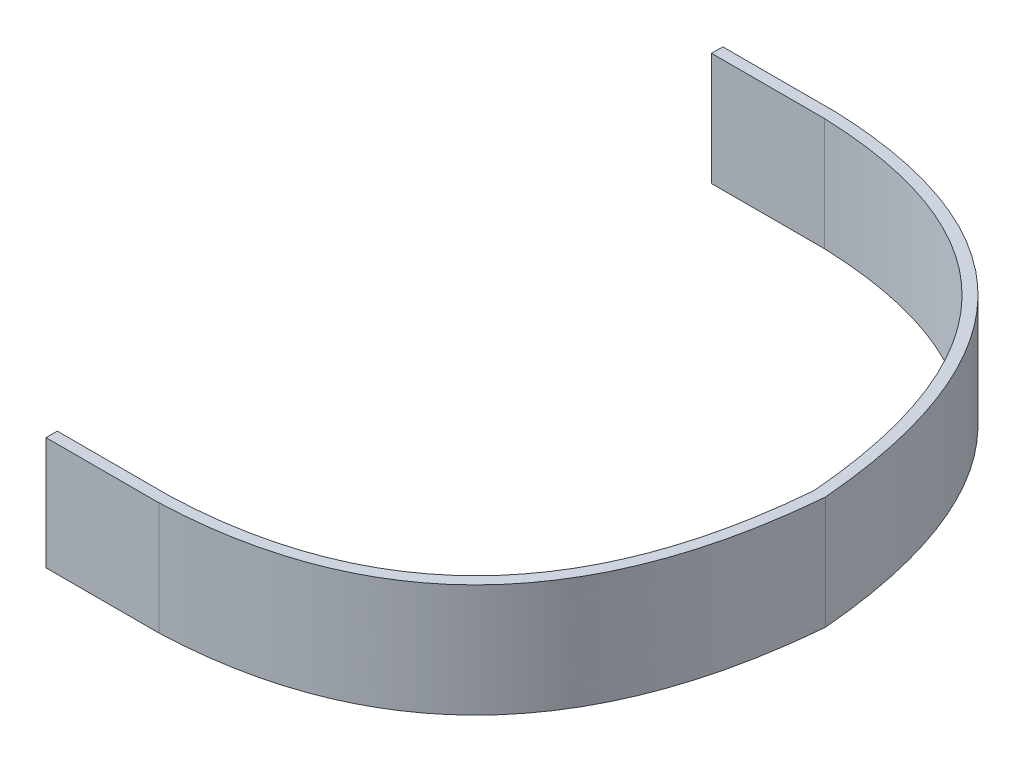
ISO-10303-21;
HEADER;
FILE_DESCRIPTION(('STEP AP214'),'2;1');
FILE_NAME('part.step','',(''),(''),'','','');
FILE_SCHEMA(('AUTOMOTIVE_DESIGN { 1 0 10303 214 1 1 1 1 }'));
ENDSEC;
DATA;
#1=APPLICATION_CONTEXT('core data for automotive mechanical design processes');
#2=APPLICATION_PROTOCOL_DEFINITION('international standard','automotive_design',2000,#1);
#3=PRODUCT_CONTEXT('',#1,'mechanical');
#4=PRODUCT('Part','Part','',(#3));
#5=PRODUCT_RELATED_PRODUCT_CATEGORY('part','',(#4));
#6=PRODUCT_DEFINITION_FORMATION('','',#4);
#7=PRODUCT_DEFINITION_CONTEXT('part definition',#1,'design');
#8=PRODUCT_DEFINITION('design','',#6,#7);
#9=PRODUCT_DEFINITION_SHAPE('','',#8);
#10=(LENGTH_UNIT() NAMED_UNIT(*) SI_UNIT(.MILLI.,.METRE.));
#11=(NAMED_UNIT(*) PLANE_ANGLE_UNIT() SI_UNIT($,.RADIAN.));
#12=(NAMED_UNIT(*) SI_UNIT($,.STERADIAN.) SOLID_ANGLE_UNIT());
#13=UNCERTAINTY_MEASURE_WITH_UNIT(LENGTH_MEASURE(1.E-05),#10,'distance_accuracy_value','');
#14=(GEOMETRIC_REPRESENTATION_CONTEXT(3) GLOBAL_UNCERTAINTY_ASSIGNED_CONTEXT((#13)) GLOBAL_UNIT_ASSIGNED_CONTEXT((#10,
#11,#12)) REPRESENTATION_CONTEXT('',''));
#15=CARTESIAN_POINT('',(0.,0.,0.));
#16=DIRECTION('',(0.,0.,1.));
#17=DIRECTION('',(1.,0.,0.));
#18=AXIS2_PLACEMENT_3D('',#15,#16,#17);
#19=CARTESIAN_POINT('',(87.3160003804693,30.,0.));
#20=CARTESIAN_POINT('',(79.9738830152221,30.,-87.0510006509807));
#21=CARTESIAN_POINT('',(0.,30.,-90.));
#22=B_SPLINE_CURVE_WITH_KNOTS('',2,(#19,#20,#21),.UNSPECIFIED.,.F.,.F.,(3,3),(0.,1.),.UNSPECIFIED.);
#23=DIRECTION('',(0.,-1.,0.));
#24=VECTOR('',#23,1.);
#25=SURFACE_OF_LINEAR_EXTRUSION('',#22,#24);
#26=CARTESIAN_POINT('',(87.3160003804693,0.,0.));
#27=CARTESIAN_POINT('',(79.9738830152221,0.,-87.0510006509807));
#28=CARTESIAN_POINT('',(0.,0.,-90.));
#29=B_SPLINE_CURVE_WITH_KNOTS('',2,(#26,#27,#28),.UNSPECIFIED.,.F.,.F.,(3,3),(0.,1.),.UNSPECIFIED.);
#30=CARTESIAN_POINT('',(87.3160003804693,0.,0.));
#31=VERTEX_POINT('',#30);
#32=CARTESIAN_POINT('',(0.,0.,-90.));
#33=VERTEX_POINT('',#32);
#34=EDGE_CURVE('E156',#31,#33,#29,.T.);
#35=ORIENTED_EDGE('',*,*,#34,.T.);
#36=DIRECTION('',(0.,-1.,0.));
#37=VECTOR('',#36,1.);
#38=CARTESIAN_POINT('',(0.,30.,-90.));
#39=LINE('',#38,#37);
#40=CARTESIAN_POINT('',(0.,30.,-90.));
#41=VERTEX_POINT('',#40);
#42=EDGE_CURVE('E11',#41,#33,#39,.T.);
#43=ORIENTED_EDGE('',*,*,#42,.F.);
#44=CARTESIAN_POINT('',(87.3160003804693,30.,0.));
#45=VERTEX_POINT('',#44);
#46=EDGE_CURVE('E208',#45,#41,#22,.T.);
#47=ORIENTED_EDGE('',*,*,#46,.F.);
#48=DIRECTION('',(0.,-1.,0.));
#49=VECTOR('',#48,1.);
#50=CARTESIAN_POINT('',(87.3160003804693,30.,0.));
#51=LINE('',#50,#49);
#52=EDGE_CURVE('E149',#45,#31,#51,.T.);
#53=ORIENTED_EDGE('',*,*,#52,.T.);
#54=EDGE_LOOP('',(#35,#43,#47,#53));
#55=FACE_BOUND('',#54,.T.);
#56=ADVANCED_FACE('F39',(#55),#25,.F.);
#57=CARTESIAN_POINT('',(0.,30.,-90.));
#58=DIRECTION('',(0.,0.,1.));
#59=DIRECTION('',(1.,0.,0.));
#60=AXIS2_PLACEMENT_3D('',#57,#58,#59);
#61=PLANE('',#60);
#62=DIRECTION('',(-1.,0.,0.));
#63=VECTOR('',#62,1.);
#64=CARTESIAN_POINT('',(0.,0.,-90.));
#65=LINE('',#64,#63);
#66=CARTESIAN_POINT('',(-30.,0.,-90.));
#67=VERTEX_POINT('',#66);
#68=EDGE_CURVE('E231',#33,#67,#65,.T.);
#69=ORIENTED_EDGE('',*,*,#68,.T.);
#70=DIRECTION('',(0.,-1.,0.));
#71=VECTOR('',#70,1.);
#72=CARTESIAN_POINT('',(-30.,30.,-90.));
#73=LINE('',#72,#71);
#74=CARTESIAN_POINT('',(-30.,30.,-90.));
#75=VERTEX_POINT('',#74);
#76=EDGE_CURVE('E49',#75,#67,#73,.T.);
#77=ORIENTED_EDGE('',*,*,#76,.F.);
#78=DIRECTION('',(-1.,0.,0.));
#79=VECTOR('',#78,1.);
#80=CARTESIAN_POINT('',(0.,30.,-90.));
#81=LINE('',#80,#79);
#82=EDGE_CURVE('E106',#41,#75,#81,.T.);
#83=ORIENTED_EDGE('',*,*,#82,.F.);
#84=ORIENTED_EDGE('',*,*,#42,.T.);
#85=EDGE_LOOP('',(#69,#77,#83,#84));
#86=FACE_BOUND('',#85,.T.);
#87=ADVANCED_FACE('F243',(#86),#61,.F.);
#88=CARTESIAN_POINT('',(-30.,30.,-90.));
#89=DIRECTION('',(1.,0.,0.));
#90=DIRECTION('',(0.,0.,-1.));
#91=AXIS2_PLACEMENT_3D('',#88,#89,#90);
#92=PLANE('',#91);
#93=DIRECTION('',(0.,0.,1.));
#94=VECTOR('',#93,1.);
#95=CARTESIAN_POINT('',(-30.,0.,-90.));
#96=LINE('',#95,#94);
#97=CARTESIAN_POINT('',(-30.,0.,-87.));
#98=VERTEX_POINT('',#97);
#99=EDGE_CURVE('E228',#67,#98,#96,.T.);
#100=ORIENTED_EDGE('',*,*,#99,.T.);
#101=DIRECTION('',(0.,-1.,0.));
#102=VECTOR('',#101,1.);
#103=CARTESIAN_POINT('',(-30.,30.,-87.));
#104=LINE('',#103,#102);
#105=CARTESIAN_POINT('',(-30.,30.,-87.));
#106=VERTEX_POINT('',#105);
#107=EDGE_CURVE('E266',#106,#98,#104,.T.);
#108=ORIENTED_EDGE('',*,*,#107,.F.);
#109=DIRECTION('',(0.,0.,1.));
#110=VECTOR('',#109,1.);
#111=CARTESIAN_POINT('',(-30.,30.,-90.));
#112=LINE('',#111,#110);
#113=EDGE_CURVE('E204',#75,#106,#112,.T.);
#114=ORIENTED_EDGE('',*,*,#113,.F.);
#115=ORIENTED_EDGE('',*,*,#76,.T.);
#116=EDGE_LOOP('',(#100,#108,#114,#115));
#117=FACE_BOUND('',#116,.T.);
#118=ADVANCED_FACE('F245',(#117),#92,.F.);
#119=CARTESIAN_POINT('',(-30.,30.,-87.));
#120=DIRECTION('',(0.,0.,-1.));
#121=DIRECTION('',(-1.,0.,0.));
#122=AXIS2_PLACEMENT_3D('',#119,#120,#121);
#123=PLANE('',#122);
#124=DIRECTION('',(1.,0.,0.));
#125=VECTOR('',#124,1.);
#126=CARTESIAN_POINT('',(-30.,0.,-87.));
#127=LINE('',#126,#125);
#128=CARTESIAN_POINT('',(0.,0.,-87.));
#129=VERTEX_POINT('',#128);
#130=EDGE_CURVE('E225',#98,#129,#127,.T.);
#131=ORIENTED_EDGE('',*,*,#130,.T.);
#132=DIRECTION('',(0.,-1.,0.));
#133=VECTOR('',#132,1.);
#134=CARTESIAN_POINT('',(0.,30.,-87.));
#135=LINE('',#134,#133);
#136=CARTESIAN_POINT('',(0.,30.,-87.));
#137=VERTEX_POINT('',#136);
#138=EDGE_CURVE('E263',#137,#129,#135,.T.);
#139=ORIENTED_EDGE('',*,*,#138,.F.);
#140=DIRECTION('',(1.,0.,0.));
#141=VECTOR('',#140,1.);
#142=CARTESIAN_POINT('',(-30.,30.,-87.));
#143=LINE('',#142,#141);
#144=EDGE_CURVE('E202',#106,#137,#143,.T.);
#145=ORIENTED_EDGE('',*,*,#144,.F.);
#146=ORIENTED_EDGE('',*,*,#107,.T.);
#147=EDGE_LOOP('',(#131,#139,#145,#146));
#148=FACE_BOUND('',#147,.T.);
#149=ADVANCED_FACE('F250',(#148),#123,.F.);
#150=CARTESIAN_POINT('',(0.,30.,-87.));
#151=CARTESIAN_POINT('',(77.3467525502243,30.,-84.2113919561588));
#152=CARTESIAN_POINT('',(84.3160003804693,30.,0.));
#153=B_SPLINE_CURVE_WITH_KNOTS('',2,(#150,#151,#152),.UNSPECIFIED.,.F.,.F.,(3,3),(0.,1.),.UNSPECIFIED.);
#154=DIRECTION('',(0.,-1.,0.));
#155=VECTOR('',#154,1.);
#156=SURFACE_OF_LINEAR_EXTRUSION('',#153,#155);
#157=CARTESIAN_POINT('',(0.,0.,-87.));
#158=CARTESIAN_POINT('',(77.3467525502243,0.,-84.2113919561588));
#159=CARTESIAN_POINT('',(84.3160003804693,0.,0.));
#160=B_SPLINE_CURVE_WITH_KNOTS('',2,(#157,#158,#159),.UNSPECIFIED.,.F.,.F.,(3,3),(0.,1.),.UNSPECIFIED.);
#161=CARTESIAN_POINT('',(84.3160003804693,0.,0.));
#162=VERTEX_POINT('',#161);
#163=EDGE_CURVE('E222',#129,#162,#160,.T.);
#164=ORIENTED_EDGE('',*,*,#163,.T.);
#165=DIRECTION('',(0.,-1.,0.));
#166=VECTOR('',#165,1.);
#167=CARTESIAN_POINT('',(84.3160003804693,30.,0.));
#168=LINE('',#167,#166);
#169=CARTESIAN_POINT('',(84.3160003804693,30.,0.));
#170=VERTEX_POINT('',#169);
#171=EDGE_CURVE('E271',#170,#162,#168,.T.);
#172=ORIENTED_EDGE('',*,*,#171,.F.);
#173=EDGE_CURVE('E191',#137,#170,#153,.T.);
#174=ORIENTED_EDGE('',*,*,#173,.F.);
#175=ORIENTED_EDGE('',*,*,#138,.T.);
#176=EDGE_LOOP('',(#164,#172,#174,#175));
#177=FACE_BOUND('',#176,.T.);
#178=ADVANCED_FACE('F182',(#177),#156,.F.);
#179=CARTESIAN_POINT('',(84.3160003804693,30.,0.));
#180=CARTESIAN_POINT('',(77.3467525502243,30.,84.2113919561588));
#181=CARTESIAN_POINT('',(0.,30.,87.));
#182=B_SPLINE_CURVE_WITH_KNOTS('',2,(#179,#180,#181),.UNSPECIFIED.,.F.,.F.,(3,3),(0.,1.),.UNSPECIFIED.);
#183=DIRECTION('',(0.,-1.,0.));
#184=VECTOR('',#183,1.);
#185=SURFACE_OF_LINEAR_EXTRUSION('',#182,#184);
#186=CARTESIAN_POINT('',(84.3160003804693,0.,0.));
#187=CARTESIAN_POINT('',(77.3467525502243,0.,84.2113919561588));
#188=CARTESIAN_POINT('',(0.,0.,87.));
#189=B_SPLINE_CURVE_WITH_KNOTS('',2,(#186,#187,#188),.UNSPECIFIED.,.F.,.F.,(3,3),(0.,1.),.UNSPECIFIED.);
#190=CARTESIAN_POINT('',(0.,0.,87.));
#191=VERTEX_POINT('',#190);
#192=EDGE_CURVE('E219',#162,#191,#189,.T.);
#193=ORIENTED_EDGE('',*,*,#192,.T.);
#194=DIRECTION('',(0.,-1.,0.));
#195=VECTOR('',#194,1.);
#196=CARTESIAN_POINT('',(0.,30.,87.));
#197=LINE('',#196,#195);
#198=CARTESIAN_POINT('',(0.,30.,87.));
#199=VERTEX_POINT('',#198);
#200=EDGE_CURVE('E278',#199,#191,#197,.T.);
#201=ORIENTED_EDGE('',*,*,#200,.F.);
#202=EDGE_CURVE('E186',#170,#199,#182,.T.);
#203=ORIENTED_EDGE('',*,*,#202,.F.);
#204=ORIENTED_EDGE('',*,*,#171,.T.);
#205=EDGE_LOOP('',(#193,#201,#203,#204));
#206=FACE_BOUND('',#205,.T.);
#207=ADVANCED_FACE('F177',(#206),#185,.F.);
#208=CARTESIAN_POINT('',(-30.,30.,87.));
#209=DIRECTION('',(0.,0.,1.));
#210=DIRECTION('',(1.,0.,0.));
#211=AXIS2_PLACEMENT_3D('',#208,#209,#210);
#212=PLANE('',#211);
#213=DIRECTION('',(-1.,0.,0.));
#214=VECTOR('',#213,1.);
#215=CARTESIAN_POINT('',(-30.,0.,87.));
#216=LINE('',#215,#214);
#217=CARTESIAN_POINT('',(-30.,0.,87.));
#218=VERTEX_POINT('',#217);
#219=EDGE_CURVE('E216',#191,#218,#216,.T.);
#220=ORIENTED_EDGE('',*,*,#219,.T.);
#221=DIRECTION('',(0.,-1.,0.));
#222=VECTOR('',#221,1.);
#223=CARTESIAN_POINT('',(-30.,30.,87.));
#224=LINE('',#223,#222);
#225=CARTESIAN_POINT('',(-30.,30.,87.));
#226=VERTEX_POINT('',#225);
#227=EDGE_CURVE('E142',#226,#218,#224,.T.);
#228=ORIENTED_EDGE('',*,*,#227,.F.);
#229=DIRECTION('',(-1.,0.,0.));
#230=VECTOR('',#229,1.);
#231=CARTESIAN_POINT('',(-30.,30.,87.));
#232=LINE('',#231,#230);
#233=EDGE_CURVE('E131',#199,#226,#232,.T.);
#234=ORIENTED_EDGE('',*,*,#233,.F.);
#235=ORIENTED_EDGE('',*,*,#200,.T.);
#236=EDGE_LOOP('',(#220,#228,#234,#235));
#237=FACE_BOUND('',#236,.T.);
#238=ADVANCED_FACE('F174',(#237),#212,.F.);
#239=CARTESIAN_POINT('',(-30.,30.,90.));
#240=DIRECTION('',(1.,0.,0.));
#241=DIRECTION('',(0.,0.,-1.));
#242=AXIS2_PLACEMENT_3D('',#239,#240,#241);
#243=PLANE('',#242);
#244=DIRECTION('',(0.,0.,1.));
#245=VECTOR('',#244,1.);
#246=CARTESIAN_POINT('',(-30.,0.,90.));
#247=LINE('',#246,#245);
#248=CARTESIAN_POINT('',(-30.,0.,90.));
#249=VERTEX_POINT('',#248);
#250=EDGE_CURVE('E140',#218,#249,#247,.T.);
#251=ORIENTED_EDGE('',*,*,#250,.T.);
#252=DIRECTION('',(0.,-1.,0.));
#253=VECTOR('',#252,1.);
#254=CARTESIAN_POINT('',(-30.,30.,90.));
#255=LINE('',#254,#253);
#256=CARTESIAN_POINT('',(-30.,30.,90.));
#257=VERTEX_POINT('',#256);
#258=EDGE_CURVE('E137',#257,#249,#255,.T.);
#259=ORIENTED_EDGE('',*,*,#258,.F.);
#260=DIRECTION('',(0.,0.,1.));
#261=VECTOR('',#260,1.);
#262=CARTESIAN_POINT('',(-30.,30.,90.));
#263=LINE('',#262,#261);
#264=EDGE_CURVE('E125',#226,#257,#263,.T.);
#265=ORIENTED_EDGE('',*,*,#264,.F.);
#266=ORIENTED_EDGE('',*,*,#227,.T.);
#267=EDGE_LOOP('',(#251,#259,#265,#266));
#268=FACE_BOUND('',#267,.T.);
#269=ADVANCED_FACE('F138',(#268),#243,.F.);
#270=CARTESIAN_POINT('',(0.,30.,90.));
#271=DIRECTION('',(0.,0.,-1.));
#272=DIRECTION('',(-1.,0.,0.));
#273=AXIS2_PLACEMENT_3D('',#270,#271,#272);
#274=PLANE('',#273);
#275=DIRECTION('',(1.,0.,0.));
#276=VECTOR('',#275,1.);
#277=CARTESIAN_POINT('',(0.,0.,90.));
#278=LINE('',#277,#276);
#279=CARTESIAN_POINT('',(0.,0.,90.));
#280=VERTEX_POINT('',#279);
#281=EDGE_CURVE('E92',#249,#280,#278,.T.);
#282=ORIENTED_EDGE('',*,*,#281,.T.);
#283=DIRECTION('',(0.,-1.,0.));
#284=VECTOR('',#283,1.);
#285=CARTESIAN_POINT('',(0.,30.,90.));
#286=LINE('',#285,#284);
#287=CARTESIAN_POINT('',(0.,30.,90.));
#288=VERTEX_POINT('',#287);
#289=EDGE_CURVE('E143',#288,#280,#286,.T.);
#290=ORIENTED_EDGE('',*,*,#289,.F.);
#291=DIRECTION('',(1.,0.,0.));
#292=VECTOR('',#291,1.);
#293=CARTESIAN_POINT('',(0.,30.,90.));
#294=LINE('',#293,#292);
#295=EDGE_CURVE('E129',#257,#288,#294,.T.);
#296=ORIENTED_EDGE('',*,*,#295,.F.);
#297=ORIENTED_EDGE('',*,*,#258,.T.);
#298=EDGE_LOOP('',(#282,#290,#296,#297));
#299=FACE_BOUND('',#298,.T.);
#300=ADVANCED_FACE('F145',(#299),#274,.F.);
#301=CARTESIAN_POINT('',(0.,30.,90.));
#302=CARTESIAN_POINT('',(79.9738830152221,30.,87.0510006509807));
#303=CARTESIAN_POINT('',(87.3160003804693,30.,0.));
#304=B_SPLINE_CURVE_WITH_KNOTS('',2,(#301,#302,#303),.UNSPECIFIED.,.F.,.F.,(3,3),(0.,1.),.UNSPECIFIED.);
#305=DIRECTION('',(0.,-1.,0.));
#306=VECTOR('',#305,1.);
#307=SURFACE_OF_LINEAR_EXTRUSION('',#304,#306);
#308=CARTESIAN_POINT('',(0.,0.,90.));
#309=CARTESIAN_POINT('',(79.9738830152221,0.,87.0510006509807));
#310=CARTESIAN_POINT('',(87.3160003804693,0.,0.));
#311=B_SPLINE_CURVE_WITH_KNOTS('',2,(#308,#309,#310),.UNSPECIFIED.,.F.,.F.,(3,3),(0.,1.),.UNSPECIFIED.);
#312=EDGE_CURVE('E98',#280,#31,#311,.T.);
#313=ORIENTED_EDGE('',*,*,#312,.T.);
#314=ORIENTED_EDGE('',*,*,#52,.F.);
#315=EDGE_CURVE('E57',#288,#45,#304,.T.);
#316=ORIENTED_EDGE('',*,*,#315,.F.);
#317=ORIENTED_EDGE('',*,*,#289,.T.);
#318=EDGE_LOOP('',(#313,#314,#316,#317));
#319=FACE_BOUND('',#318,.T.);
#320=ADVANCED_FACE('F164',(#319),#307,.F.);
#321=CARTESIAN_POINT('',(61.8159416027284,30.,-66.0255003254903));
#322=DIRECTION('',(0.,1.,0.));
#323=DIRECTION('',(0.,0.,1.));
#324=AXIS2_PLACEMENT_3D('',#321,#322,#323);
#325=PLANE('',#324);
#326=ORIENTED_EDGE('',*,*,#46,.T.);
#327=ORIENTED_EDGE('',*,*,#82,.T.);
#328=ORIENTED_EDGE('',*,*,#113,.T.);
#329=ORIENTED_EDGE('',*,*,#144,.T.);
#330=ORIENTED_EDGE('',*,*,#173,.T.);
#331=ORIENTED_EDGE('',*,*,#202,.T.);
#332=ORIENTED_EDGE('',*,*,#233,.T.);
#333=ORIENTED_EDGE('',*,*,#264,.T.);
#334=ORIENTED_EDGE('',*,*,#295,.T.);
#335=ORIENTED_EDGE('',*,*,#315,.T.);
#336=EDGE_LOOP('',(#326,#327,#328,#329,#330,#331,#332,#333,#334,#335));
#337=FACE_BOUND('',#336,.T.);
#338=ADVANCED_FACE('F127',(#337),#325,.T.);
#339=CARTESIAN_POINT('',(61.8159416027284,0.,-66.0255003254903));
#340=DIRECTION('',(0.,1.,0.));
#341=DIRECTION('',(0.,0.,1.));
#342=AXIS2_PLACEMENT_3D('',#339,#340,#341);
#343=PLANE('',#342);
#344=ORIENTED_EDGE('',*,*,#34,.F.);
#345=ORIENTED_EDGE('',*,*,#312,.F.);
#346=ORIENTED_EDGE('',*,*,#281,.F.);
#347=ORIENTED_EDGE('',*,*,#250,.F.);
#348=ORIENTED_EDGE('',*,*,#219,.F.);
#349=ORIENTED_EDGE('',*,*,#192,.F.);
#350=ORIENTED_EDGE('',*,*,#163,.F.);
#351=ORIENTED_EDGE('',*,*,#130,.F.);
#352=ORIENTED_EDGE('',*,*,#99,.F.);
#353=ORIENTED_EDGE('',*,*,#68,.F.);
#354=EDGE_LOOP('',(#344,#345,#346,#347,#348,#349,#350,#351,#352,#353));
#355=FACE_BOUND('',#354,.T.);
#356=ADVANCED_FACE('F168',(#355),#343,.F.);
#357=CLOSED_SHELL('',(#56,#87,#118,#149,#178,#207,#238,#269,#300,#320,#338,#356));
#358=MANIFOLD_SOLID_BREP('B2',#357);
#359=ADVANCED_BREP_SHAPE_REPRESENTATION('',(#18,#358),#14);
#360=SHAPE_DEFINITION_REPRESENTATION(#9,#359);
ENDSEC;
END-ISO-10303-21;
